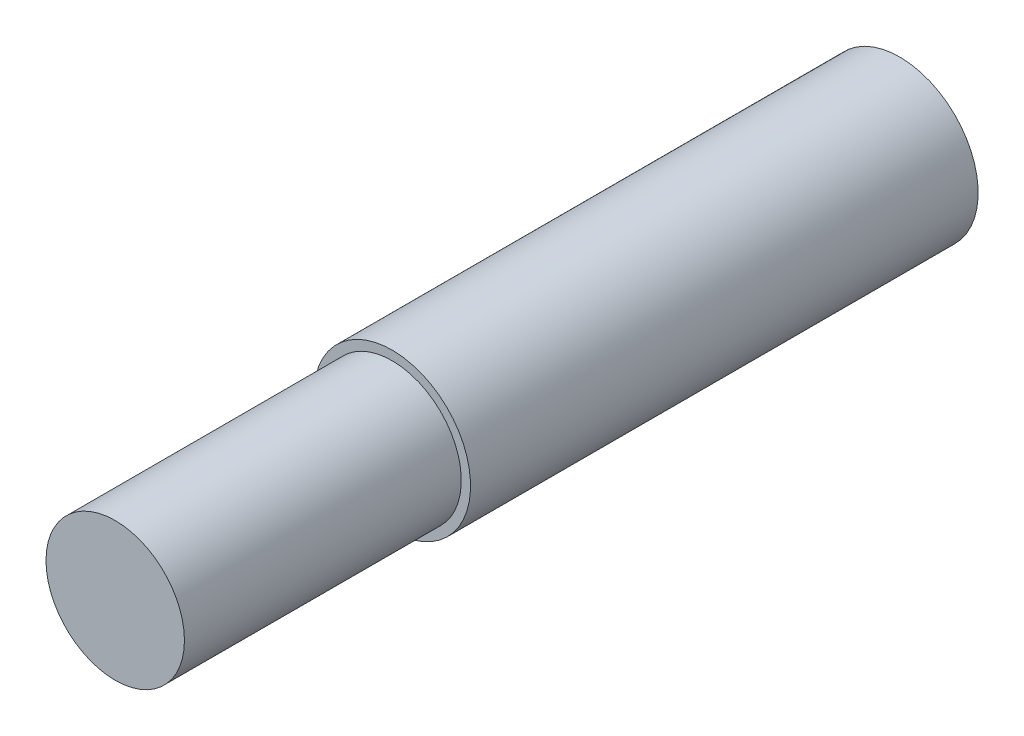
ISO-10303-21;
HEADER;
FILE_DESCRIPTION(('STEP AP214'),'2;1');
FILE_NAME('part.step','',(''),(''),'','','');
FILE_SCHEMA(('AUTOMOTIVE_DESIGN { 1 0 10303 214 1 1 1 1 }'));
ENDSEC;
DATA;
#1=APPLICATION_CONTEXT('core data for automotive mechanical design processes');
#2=APPLICATION_PROTOCOL_DEFINITION('international standard','automotive_design',2000,#1);
#3=PRODUCT_CONTEXT('',#1,'mechanical');
#4=PRODUCT('Part','Part','',(#3));
#5=PRODUCT_RELATED_PRODUCT_CATEGORY('part','',(#4));
#6=PRODUCT_DEFINITION_FORMATION('','',#4);
#7=PRODUCT_DEFINITION_CONTEXT('part definition',#1,'design');
#8=PRODUCT_DEFINITION('design','',#6,#7);
#9=PRODUCT_DEFINITION_SHAPE('','',#8);
#10=(LENGTH_UNIT() NAMED_UNIT(*) SI_UNIT(.MILLI.,.METRE.));
#11=(NAMED_UNIT(*) PLANE_ANGLE_UNIT() SI_UNIT($,.RADIAN.));
#12=(NAMED_UNIT(*) SI_UNIT($,.STERADIAN.) SOLID_ANGLE_UNIT());
#13=UNCERTAINTY_MEASURE_WITH_UNIT(LENGTH_MEASURE(1.E-05),#10,'distance_accuracy_value','');
#14=(GEOMETRIC_REPRESENTATION_CONTEXT(3) GLOBAL_UNCERTAINTY_ASSIGNED_CONTEXT((#13)) GLOBAL_UNIT_ASSIGNED_CONTEXT((#10,
#11,#12)) REPRESENTATION_CONTEXT('',''));
#15=CARTESIAN_POINT('',(0.,0.,0.));
#16=DIRECTION('',(0.,0.,1.));
#17=DIRECTION('',(1.,0.,0.));
#18=AXIS2_PLACEMENT_3D('',#15,#16,#17);
#19=CARTESIAN_POINT('',(0.,0.,30.));
#20=DIRECTION('',(0.,0.,-1.));
#21=DIRECTION('',(-1.,0.,0.));
#22=AXIS2_PLACEMENT_3D('',#19,#20,#21);
#23=CYLINDRICAL_SURFACE('',#22,7.5);
#24=CARTESIAN_POINT('',(0.,0.,30.));
#25=DIRECTION('',(0.,0.,1.));
#26=DIRECTION('',(1.,0.,0.));
#27=AXIS2_PLACEMENT_3D('',#24,#25,#26);
#28=CIRCLE('',#27,7.5);
#29=CARTESIAN_POINT('',(7.5,0.,30.));
#30=VERTEX_POINT('',#29);
#31=EDGE_CURVE('E43',#30,#30,#28,.T.);
#32=ORIENTED_EDGE('',*,*,#31,.F.);
#33=EDGE_LOOP('',(#32));
#34=FACE_BOUND('',#33,.T.);
#35=CARTESIAN_POINT('',(0.,0.,0.));
#36=DIRECTION('',(0.,0.,-1.));
#37=DIRECTION('',(-1.,0.,0.));
#38=AXIS2_PLACEMENT_3D('',#35,#36,#37);
#39=CIRCLE('',#38,7.5);
#40=CARTESIAN_POINT('',(-7.5,0.,0.));
#41=VERTEX_POINT('',#40);
#42=EDGE_CURVE('E47',#41,#41,#39,.T.);
#43=ORIENTED_EDGE('',*,*,#42,.F.);
#44=EDGE_LOOP('',(#43));
#45=FACE_BOUND('',#44,.T.);
#46=ADVANCED_FACE('F37',(#34,#45),#23,.T.);
#47=CARTESIAN_POINT('',(0.,0.,30.));
#48=DIRECTION('',(0.,0.,1.));
#49=DIRECTION('',(1.,0.,0.));
#50=AXIS2_PLACEMENT_3D('',#47,#48,#49);
#51=PLANE('',#50);
#52=ORIENTED_EDGE('',*,*,#31,.T.);
#53=EDGE_LOOP('',(#52));
#54=FACE_BOUND('',#53,.T.);
#55=ADVANCED_FACE('F68',(#54),#51,.T.);
#56=CARTESIAN_POINT('',(0.,0.,-55.));
#57=DIRECTION('',(0.,0.,-1.));
#58=DIRECTION('',(-1.,0.,0.));
#59=AXIS2_PLACEMENT_3D('',#56,#57,#58);
#60=PLANE('',#59);
#61=CARTESIAN_POINT('',(0.,0.,-55.));
#62=DIRECTION('',(0.,0.,-1.));
#63=DIRECTION('',(-1.,0.,0.));
#64=AXIS2_PLACEMENT_3D('',#61,#62,#63);
#65=CIRCLE('',#64,8.5);
#66=CARTESIAN_POINT('',(-8.5,0.,-55.));
#67=VERTEX_POINT('',#66);
#68=EDGE_CURVE('E51',#67,#67,#65,.T.);
#69=ORIENTED_EDGE('',*,*,#68,.T.);
#70=EDGE_LOOP('',(#69));
#71=FACE_BOUND('',#70,.T.);
#72=CARTESIAN_POINT('',(0.,0.,-55.));
#73=DIRECTION('',(0.,0.,-1.));
#74=DIRECTION('',(-1.,0.,0.));
#75=AXIS2_PLACEMENT_3D('',#72,#73,#74);
#76=CIRCLE('',#75,6.);
#77=CARTESIAN_POINT('',(-6.,0.,-55.));
#78=VERTEX_POINT('',#77);
#79=EDGE_CURVE('E57',#78,#78,#76,.T.);
#80=ORIENTED_EDGE('',*,*,#79,.F.);
#81=EDGE_LOOP('',(#80));
#82=FACE_BOUND('',#81,.T.);
#83=ADVANCED_FACE('F65',(#71,#82),#60,.T.);
#84=CARTESIAN_POINT('',(0.,0.,0.));
#85=DIRECTION('',(0.,0.,-1.));
#86=DIRECTION('',(-1.,0.,0.));
#87=AXIS2_PLACEMENT_3D('',#84,#85,#86);
#88=PLANE('',#87);
#89=ORIENTED_EDGE('',*,*,#42,.T.);
#90=EDGE_LOOP('',(#89));
#91=FACE_BOUND('',#90,.T.);
#92=CARTESIAN_POINT('',(0.,0.,0.));
#93=DIRECTION('',(0.,0.,-1.));
#94=DIRECTION('',(-1.,0.,0.));
#95=AXIS2_PLACEMENT_3D('',#92,#93,#94);
#96=CIRCLE('',#95,8.5);
#97=CARTESIAN_POINT('',(-8.5,0.,0.));
#98=VERTEX_POINT('',#97);
#99=EDGE_CURVE('E54',#98,#98,#96,.T.);
#100=ORIENTED_EDGE('',*,*,#99,.F.);
#101=EDGE_LOOP('',(#100));
#102=FACE_BOUND('',#101,.T.);
#103=ADVANCED_FACE('F67',(#91,#102),#88,.F.);
#104=CARTESIAN_POINT('',(0.,0.,-55.));
#105=DIRECTION('',(0.,0.,1.));
#106=DIRECTION('',(1.,0.,0.));
#107=AXIS2_PLACEMENT_3D('',#104,#105,#106);
#108=CYLINDRICAL_SURFACE('',#107,8.5);
#109=ORIENTED_EDGE('',*,*,#68,.F.);
#110=EDGE_LOOP('',(#109));
#111=FACE_BOUND('',#110,.T.);
#112=ORIENTED_EDGE('',*,*,#99,.T.);
#113=EDGE_LOOP('',(#112));
#114=FACE_BOUND('',#113,.T.);
#115=ADVANCED_FACE('F75',(#111,#114),#108,.T.);
#116=CARTESIAN_POINT('',(0.,0.,-55.));
#117=DIRECTION('',(0.,0.,1.));
#118=DIRECTION('',(1.,0.,0.));
#119=AXIS2_PLACEMENT_3D('',#116,#117,#118);
#120=CYLINDRICAL_SURFACE('',#119,6.);
#121=CARTESIAN_POINT('',(0.,0.,-3.));
#122=DIRECTION('',(0.,0.,-1.));
#123=DIRECTION('',(-1.,0.,0.));
#124=AXIS2_PLACEMENT_3D('',#121,#122,#123);
#125=CIRCLE('',#124,6.);
#126=CARTESIAN_POINT('',(-6.,0.,-3.));
#127=VERTEX_POINT('',#126);
#128=EDGE_CURVE('E10',#127,#127,#125,.T.);
#129=ORIENTED_EDGE('',*,*,#128,.F.);
#130=EDGE_LOOP('',(#129));
#131=FACE_BOUND('',#130,.T.);
#132=ORIENTED_EDGE('',*,*,#79,.T.);
#133=EDGE_LOOP('',(#132));
#134=FACE_BOUND('',#133,.T.);
#135=ADVANCED_FACE('F63',(#131,#134),#120,.F.);
#136=CARTESIAN_POINT('',(0.,0.,-3.));
#137=DIRECTION('',(0.,0.,-1.));
#138=DIRECTION('',(-1.,0.,0.));
#139=AXIS2_PLACEMENT_3D('',#136,#137,#138);
#140=PLANE('',#139);
#141=ORIENTED_EDGE('',*,*,#128,.T.);
#142=EDGE_LOOP('',(#141));
#143=FACE_BOUND('',#142,.T.);
#144=ADVANCED_FACE('F94',(#143),#140,.T.);
#145=CLOSED_SHELL('',(#46,#55,#83,#103,#115,#135,#144));
#146=MANIFOLD_SOLID_BREP('B2',#145);
#147=ADVANCED_BREP_SHAPE_REPRESENTATION('',(#18,#146),#14);
#148=SHAPE_DEFINITION_REPRESENTATION(#9,#147);
ENDSEC;
END-ISO-10303-21;
